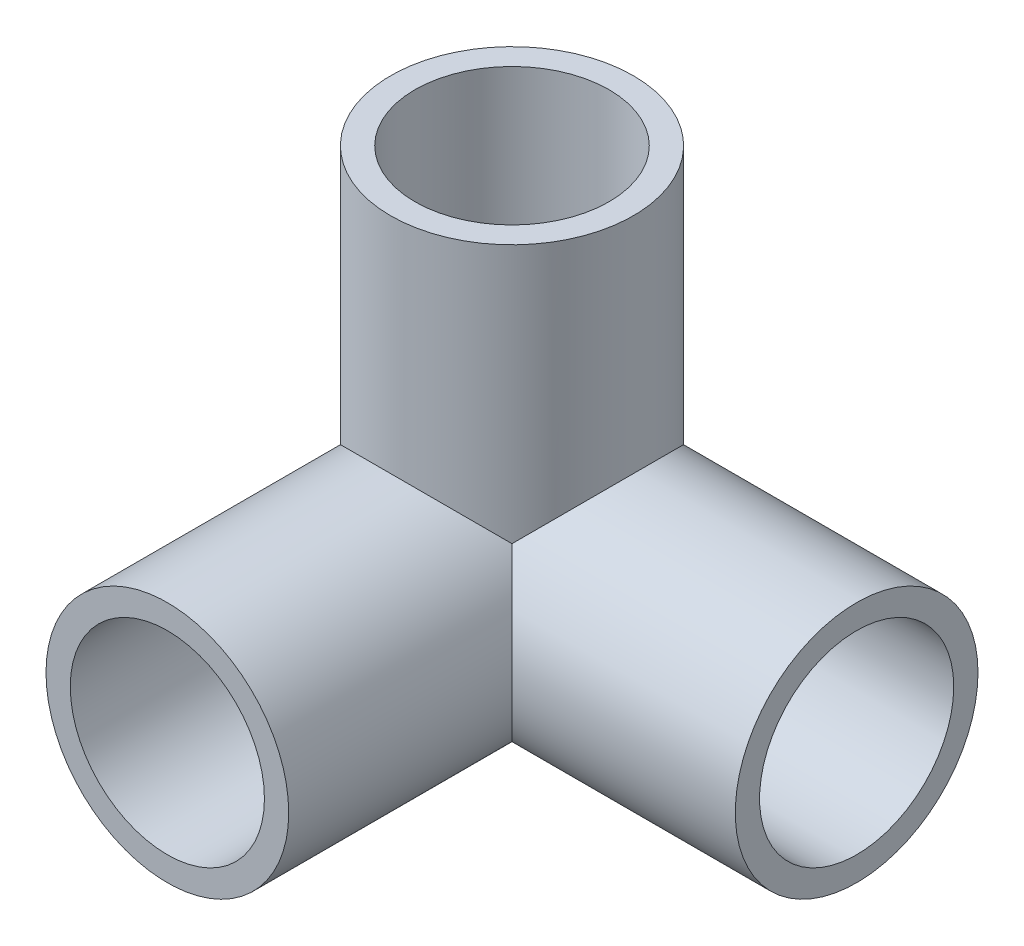
ISO-10303-21;
HEADER;
FILE_DESCRIPTION(('STEP AP214'),'2;1');
FILE_NAME('part.step','',(''),(''),'','','');
FILE_SCHEMA(('AUTOMOTIVE_DESIGN { 1 0 10303 214 1 1 1 1 }'));
ENDSEC;
DATA;
#1=APPLICATION_CONTEXT('core data for automotive mechanical design processes');
#2=APPLICATION_PROTOCOL_DEFINITION('international standard','automotive_design',2000,#1);
#3=PRODUCT_CONTEXT('',#1,'mechanical');
#4=PRODUCT('Part','Part','',(#3));
#5=PRODUCT_RELATED_PRODUCT_CATEGORY('part','',(#4));
#6=PRODUCT_DEFINITION_FORMATION('','',#4);
#7=PRODUCT_DEFINITION_CONTEXT('part definition',#1,'design');
#8=PRODUCT_DEFINITION('design','',#6,#7);
#9=PRODUCT_DEFINITION_SHAPE('','',#8);
#10=(LENGTH_UNIT() NAMED_UNIT(*) SI_UNIT(.MILLI.,.METRE.));
#11=(NAMED_UNIT(*) PLANE_ANGLE_UNIT() SI_UNIT($,.RADIAN.));
#12=(NAMED_UNIT(*) SI_UNIT($,.STERADIAN.) SOLID_ANGLE_UNIT());
#13=UNCERTAINTY_MEASURE_WITH_UNIT(LENGTH_MEASURE(1.E-05),#10,'distance_accuracy_value','');
#14=(GEOMETRIC_REPRESENTATION_CONTEXT(3) GLOBAL_UNCERTAINTY_ASSIGNED_CONTEXT((#13)) GLOBAL_UNIT_ASSIGNED_CONTEXT((#10,
#11,#12)) REPRESENTATION_CONTEXT('',''));
#15=CARTESIAN_POINT('',(0.,0.,0.));
#16=DIRECTION('',(0.,0.,1.));
#17=DIRECTION('',(1.,0.,0.));
#18=AXIS2_PLACEMENT_3D('',#15,#16,#17);
#19=CARTESIAN_POINT('',(0.,0.,35.5));
#20=DIRECTION('',(0.,0.,-1.));
#21=DIRECTION('',(-1.,0.,0.));
#22=AXIS2_PLACEMENT_3D('',#19,#20,#21);
#23=CYLINDRICAL_SURFACE('',#22,12.5);
#24=CARTESIAN_POINT('',(0.,0.,35.5));
#25=DIRECTION('',(0.,0.,1.));
#26=DIRECTION('',(1.,0.,0.));
#27=AXIS2_PLACEMENT_3D('',#24,#25,#26);
#28=CIRCLE('',#27,12.5);
#29=CARTESIAN_POINT('',(12.5,0.,35.5));
#30=VERTEX_POINT('',#29);
#31=EDGE_CURVE('E47',#30,#30,#28,.T.);
#32=ORIENTED_EDGE('',*,*,#31,.F.);
#33=EDGE_LOOP('',(#32));
#34=FACE_BOUND('',#33,.T.);
#35=CARTESIAN_POINT('',(0.,0.,0.));
#36=DIRECTION('',(0.707106781186547,0.,-0.707106781186547));
#37=DIRECTION('',(-0.707106781186547,0.,-0.707106781186547));
#38=AXIS2_PLACEMENT_3D('',#35,#36,#37);
#39=ELLIPSE('',#38,17.6776695296637,12.5);
#40=CARTESIAN_POINT('',(8.83883476483184,8.83883476483184,8.83883476483184));
#41=VERTEX_POINT('',#40);
#42=CARTESIAN_POINT('',(0.,-12.5,0.));
#43=VERTEX_POINT('',#42);
#44=EDGE_CURVE('E106',#41,#43,#39,.T.);
#45=ORIENTED_EDGE('',*,*,#44,.F.);
#46=CARTESIAN_POINT('',(0.,0.,0.));
#47=DIRECTION('',(0.,0.707106781186547,-0.707106781186547));
#48=DIRECTION('',(0.,-0.707106781186547,-0.707106781186547));
#49=AXIS2_PLACEMENT_3D('',#46,#47,#48);
#50=ELLIPSE('',#49,17.6776695296637,12.5);
#51=CARTESIAN_POINT('',(-12.5,0.,0.));
#52=VERTEX_POINT('',#51);
#53=EDGE_CURVE('E110',#52,#41,#50,.T.);
#54=ORIENTED_EDGE('',*,*,#53,.F.);
#55=CARTESIAN_POINT('',(0.,0.,0.));
#56=DIRECTION('',(0.,0.,-1.));
#57=DIRECTION('',(-1.,0.,0.));
#58=AXIS2_PLACEMENT_3D('',#55,#56,#57);
#59=CIRCLE('',#58,12.5);
#60=EDGE_CURVE('E112',#52,#43,#59,.F.);
#61=ORIENTED_EDGE('',*,*,#60,.T.);
#62=EDGE_LOOP('',(#45,#54,#61));
#63=FACE_BOUND('',#62,.T.);
#64=ADVANCED_FACE('F37',(#34,#63),#23,.T.);
#65=CARTESIAN_POINT('',(0.,0.,0.));
#66=DIRECTION('',(0.,-1.,0.));
#67=DIRECTION('',(-1.,0.,0.));
#68=AXIS2_PLACEMENT_3D('',#65,#66,#67);
#69=SPHERICAL_SURFACE('',#68,12.5);
#70=CARTESIAN_POINT('',(0.,0.,0.));
#71=DIRECTION('',(0.,-1.,0.));
#72=DIRECTION('',(0.,0.,-1.));
#73=AXIS2_PLACEMENT_3D('',#70,#71,#72);
#74=CIRCLE('',#73,12.5);
#75=CARTESIAN_POINT('',(0.,0.,-12.5));
#76=VERTEX_POINT('',#75);
#77=EDGE_CURVE('E109',#76,#52,#74,.F.);
#78=ORIENTED_EDGE('',*,*,#77,.F.);
#79=CARTESIAN_POINT('',(0.,0.,0.));
#80=DIRECTION('',(-1.,0.,0.));
#81=DIRECTION('',(0.,0.,1.));
#82=AXIS2_PLACEMENT_3D('',#79,#80,#81);
#83=CIRCLE('',#82,12.5);
#84=EDGE_CURVE('E54',#43,#76,#83,.F.);
#85=ORIENTED_EDGE('',*,*,#84,.F.);
#86=ORIENTED_EDGE('',*,*,#60,.F.);
#87=EDGE_LOOP('',(#78,#85,#86));
#88=FACE_BOUND('',#87,.T.);
#89=ADVANCED_FACE('F126',(#88),#69,.T.);
#90=CARTESIAN_POINT('',(0.,35.5,0.));
#91=DIRECTION('',(0.,-1.,0.));
#92=DIRECTION('',(0.,0.,-1.));
#93=AXIS2_PLACEMENT_3D('',#90,#91,#92);
#94=CYLINDRICAL_SURFACE('',#93,12.5);
#95=CARTESIAN_POINT('',(0.,35.5,0.));
#96=DIRECTION('',(0.,1.,0.));
#97=DIRECTION('',(0.,0.,1.));
#98=AXIS2_PLACEMENT_3D('',#95,#96,#97);
#99=CIRCLE('',#98,12.5);
#100=CARTESIAN_POINT('',(0.,35.5,12.5));
#101=VERTEX_POINT('',#100);
#102=EDGE_CURVE('E113',#101,#101,#99,.T.);
#103=ORIENTED_EDGE('',*,*,#102,.F.);
#104=EDGE_LOOP('',(#103));
#105=FACE_BOUND('',#104,.T.);
#106=CARTESIAN_POINT('',(0.,0.,0.));
#107=DIRECTION('',(0.707106781186547,-0.707106781186547,0.));
#108=DIRECTION('',(-0.707106781186547,-0.707106781186547,0.));
#109=AXIS2_PLACEMENT_3D('',#106,#107,#108);
#110=ELLIPSE('',#109,17.6776695296637,12.5);
#111=EDGE_CURVE('E11',#76,#41,#110,.T.);
#112=ORIENTED_EDGE('',*,*,#111,.F.);
#113=ORIENTED_EDGE('',*,*,#77,.T.);
#114=ORIENTED_EDGE('',*,*,#53,.T.);
#115=EDGE_LOOP('',(#112,#113,#114));
#116=FACE_BOUND('',#115,.T.);
#117=ADVANCED_FACE('F122',(#105,#116),#94,.T.);
#118=CARTESIAN_POINT('',(0.,0.,35.5));
#119=DIRECTION('',(0.,0.,1.));
#120=DIRECTION('',(1.,0.,0.));
#121=AXIS2_PLACEMENT_3D('',#118,#119,#120);
#122=PLANE('',#121);
#123=CARTESIAN_POINT('',(0.,0.,35.5));
#124=DIRECTION('',(0.,0.,1.));
#125=DIRECTION('',(1.,0.,0.));
#126=AXIS2_PLACEMENT_3D('',#123,#124,#125);
#127=CIRCLE('',#126,10.);
#128=CARTESIAN_POINT('',(10.,0.,35.5));
#129=VERTEX_POINT('',#128);
#130=EDGE_CURVE('E99',#129,#129,#127,.T.);
#131=ORIENTED_EDGE('',*,*,#130,.F.);
#132=EDGE_LOOP('',(#131));
#133=FACE_BOUND('',#132,.T.);
#134=ORIENTED_EDGE('',*,*,#31,.T.);
#135=EDGE_LOOP('',(#134));
#136=FACE_BOUND('',#135,.T.);
#137=ADVANCED_FACE('F125',(#133,#136),#122,.T.);
#138=CARTESIAN_POINT('',(0.,35.5,0.));
#139=DIRECTION('',(0.,1.,0.));
#140=DIRECTION('',(0.,0.,1.));
#141=AXIS2_PLACEMENT_3D('',#138,#139,#140);
#142=PLANE('',#141);
#143=CARTESIAN_POINT('',(0.,35.5,0.));
#144=DIRECTION('',(0.,1.,0.));
#145=DIRECTION('',(0.,0.,1.));
#146=AXIS2_PLACEMENT_3D('',#143,#144,#145);
#147=CIRCLE('',#146,10.);
#148=CARTESIAN_POINT('',(0.,35.5,10.));
#149=VERTEX_POINT('',#148);
#150=EDGE_CURVE('E88',#149,#149,#147,.T.);
#151=ORIENTED_EDGE('',*,*,#150,.F.);
#152=EDGE_LOOP('',(#151));
#153=FACE_BOUND('',#152,.T.);
#154=ORIENTED_EDGE('',*,*,#102,.T.);
#155=EDGE_LOOP('',(#154));
#156=FACE_BOUND('',#155,.T.);
#157=ADVANCED_FACE('F120',(#153,#156),#142,.T.);
#158=CARTESIAN_POINT('',(35.5,0.,0.));
#159=DIRECTION('',(-1.,0.,0.));
#160=DIRECTION('',(0.,0.,1.));
#161=AXIS2_PLACEMENT_3D('',#158,#159,#160);
#162=CYLINDRICAL_SURFACE('',#161,12.5);
#163=CARTESIAN_POINT('',(35.5,0.,0.));
#164=DIRECTION('',(1.,0.,0.));
#165=DIRECTION('',(0.,0.,-1.));
#166=AXIS2_PLACEMENT_3D('',#163,#164,#165);
#167=CIRCLE('',#166,12.5);
#168=CARTESIAN_POINT('',(35.5,0.,-12.5));
#169=VERTEX_POINT('',#168);
#170=EDGE_CURVE('E41',#169,#169,#167,.T.);
#171=ORIENTED_EDGE('',*,*,#170,.F.);
#172=EDGE_LOOP('',(#171));
#173=FACE_BOUND('',#172,.T.);
#174=ORIENTED_EDGE('',*,*,#111,.T.);
#175=ORIENTED_EDGE('',*,*,#44,.T.);
#176=ORIENTED_EDGE('',*,*,#84,.T.);
#177=EDGE_LOOP('',(#174,#175,#176));
#178=FACE_BOUND('',#177,.T.);
#179=ADVANCED_FACE('F39',(#173,#178),#162,.T.);
#180=CARTESIAN_POINT('',(35.5,0.,0.));
#181=DIRECTION('',(1.,0.,0.));
#182=DIRECTION('',(0.,0.,-1.));
#183=AXIS2_PLACEMENT_3D('',#180,#181,#182);
#184=PLANE('',#183);
#185=CARTESIAN_POINT('',(35.5,0.,0.));
#186=DIRECTION('',(1.,0.,0.));
#187=DIRECTION('',(0.,0.,-1.));
#188=AXIS2_PLACEMENT_3D('',#185,#186,#187);
#189=CIRCLE('',#188,10.);
#190=CARTESIAN_POINT('',(35.5,0.,-10.));
#191=VERTEX_POINT('',#190);
#192=EDGE_CURVE('E96',#191,#191,#189,.T.);
#193=ORIENTED_EDGE('',*,*,#192,.F.);
#194=EDGE_LOOP('',(#193));
#195=FACE_BOUND('',#194,.T.);
#196=ORIENTED_EDGE('',*,*,#170,.T.);
#197=EDGE_LOOP('',(#196));
#198=FACE_BOUND('',#197,.T.);
#199=ADVANCED_FACE('F146',(#195,#198),#184,.T.);
#200=CARTESIAN_POINT('',(0.,0.,35.5));
#201=DIRECTION('',(0.,0.,-1.));
#202=DIRECTION('',(-1.,0.,0.));
#203=AXIS2_PLACEMENT_3D('',#200,#201,#202);
#204=CYLINDRICAL_SURFACE('',#203,10.);
#205=ORIENTED_EDGE('',*,*,#130,.T.);
#206=EDGE_LOOP('',(#205));
#207=FACE_BOUND('',#206,.T.);
#208=CARTESIAN_POINT('',(0.,0.,0.));
#209=DIRECTION('',(0.707106781186547,0.,-0.707106781186547));
#210=DIRECTION('',(-0.707106781186547,0.,-0.707106781186547));
#211=AXIS2_PLACEMENT_3D('',#208,#209,#210);
#212=ELLIPSE('',#211,14.1421356237309,10.);
#213=CARTESIAN_POINT('',(7.07106781186547,7.07106781186547,7.07106781186547));
#214=VERTEX_POINT('',#213);
#215=CARTESIAN_POINT('',(0.,-10.,0.));
#216=VERTEX_POINT('',#215);
#217=EDGE_CURVE('E82',#214,#216,#212,.T.);
#218=ORIENTED_EDGE('',*,*,#217,.T.);
#219=CARTESIAN_POINT('',(0.,0.,0.));
#220=DIRECTION('',(0.,0.,1.));
#221=DIRECTION('',(1.,0.,0.));
#222=AXIS2_PLACEMENT_3D('',#219,#220,#221);
#223=CIRCLE('',#222,10.);
#224=CARTESIAN_POINT('',(-10.,0.,0.));
#225=VERTEX_POINT('',#224);
#226=EDGE_CURVE('E84',#225,#216,#223,.T.);
#227=ORIENTED_EDGE('',*,*,#226,.F.);
#228=CARTESIAN_POINT('',(0.,0.,0.));
#229=DIRECTION('',(0.,0.707106781186547,-0.707106781186547));
#230=DIRECTION('',(0.,-0.707106781186547,-0.707106781186547));
#231=AXIS2_PLACEMENT_3D('',#228,#229,#230);
#232=ELLIPSE('',#231,14.1421356237309,10.);
#233=EDGE_CURVE('E79',#225,#214,#232,.T.);
#234=ORIENTED_EDGE('',*,*,#233,.T.);
#235=EDGE_LOOP('',(#218,#227,#234));
#236=FACE_BOUND('',#235,.T.);
#237=ADVANCED_FACE('F81',(#207,#236),#204,.F.);
#238=CARTESIAN_POINT('',(0.,0.,0.));
#239=DIRECTION('',(0.,-1.,0.));
#240=DIRECTION('',(-1.,0.,0.));
#241=AXIS2_PLACEMENT_3D('',#238,#239,#240);
#242=SPHERICAL_SURFACE('',#241,10.);
#243=CARTESIAN_POINT('',(0.,0.,0.));
#244=DIRECTION('',(0.,1.,0.));
#245=DIRECTION('',(0.,0.,1.));
#246=AXIS2_PLACEMENT_3D('',#243,#244,#245);
#247=CIRCLE('',#246,10.);
#248=CARTESIAN_POINT('',(0.,0.,-10.));
#249=VERTEX_POINT('',#248);
#250=EDGE_CURVE('E95',#249,#225,#247,.T.);
#251=ORIENTED_EDGE('',*,*,#250,.T.);
#252=ORIENTED_EDGE('',*,*,#226,.T.);
#253=CARTESIAN_POINT('',(0.,0.,0.));
#254=DIRECTION('',(1.,0.,0.));
#255=DIRECTION('',(0.,0.,-1.));
#256=AXIS2_PLACEMENT_3D('',#253,#254,#255);
#257=CIRCLE('',#256,10.);
#258=EDGE_CURVE('E94',#216,#249,#257,.T.);
#259=ORIENTED_EDGE('',*,*,#258,.T.);
#260=EDGE_LOOP('',(#251,#252,#259));
#261=FACE_BOUND('',#260,.T.);
#262=ADVANCED_FACE('F150',(#261),#242,.F.);
#263=CARTESIAN_POINT('',(0.,35.5,0.));
#264=DIRECTION('',(0.,-1.,0.));
#265=DIRECTION('',(0.,0.,-1.));
#266=AXIS2_PLACEMENT_3D('',#263,#264,#265);
#267=CYLINDRICAL_SURFACE('',#266,10.);
#268=ORIENTED_EDGE('',*,*,#150,.T.);
#269=EDGE_LOOP('',(#268));
#270=FACE_BOUND('',#269,.T.);
#271=CARTESIAN_POINT('',(0.,0.,0.));
#272=DIRECTION('',(0.707106781186547,-0.707106781186547,0.));
#273=DIRECTION('',(-0.707106781186547,-0.707106781186547,0.));
#274=AXIS2_PLACEMENT_3D('',#271,#272,#273);
#275=ELLIPSE('',#274,14.1421356237309,10.);
#276=EDGE_CURVE('E92',#249,#214,#275,.T.);
#277=ORIENTED_EDGE('',*,*,#276,.T.);
#278=ORIENTED_EDGE('',*,*,#233,.F.);
#279=ORIENTED_EDGE('',*,*,#250,.F.);
#280=EDGE_LOOP('',(#277,#278,#279));
#281=FACE_BOUND('',#280,.T.);
#282=ADVANCED_FACE('F98',(#270,#281),#267,.F.);
#283=CARTESIAN_POINT('',(35.5,0.,0.));
#284=DIRECTION('',(-1.,0.,0.));
#285=DIRECTION('',(0.,0.,1.));
#286=AXIS2_PLACEMENT_3D('',#283,#284,#285);
#287=CYLINDRICAL_SURFACE('',#286,10.);
#288=ORIENTED_EDGE('',*,*,#192,.T.);
#289=EDGE_LOOP('',(#288));
#290=FACE_BOUND('',#289,.T.);
#291=ORIENTED_EDGE('',*,*,#276,.F.);
#292=ORIENTED_EDGE('',*,*,#258,.F.);
#293=ORIENTED_EDGE('',*,*,#217,.F.);
#294=EDGE_LOOP('',(#291,#292,#293));
#295=FACE_BOUND('',#294,.T.);
#296=ADVANCED_FACE('F91',(#290,#295),#287,.F.);
#297=CLOSED_SHELL('',(#64,#89,#117,#137,#157,#179,#199,#237,#262,#282,#296));
#298=MANIFOLD_SOLID_BREP('B2',#297);
#299=ADVANCED_BREP_SHAPE_REPRESENTATION('',(#18,#298),#14);
#300=SHAPE_DEFINITION_REPRESENTATION(#9,#299);
ENDSEC;
END-ISO-10303-21;
